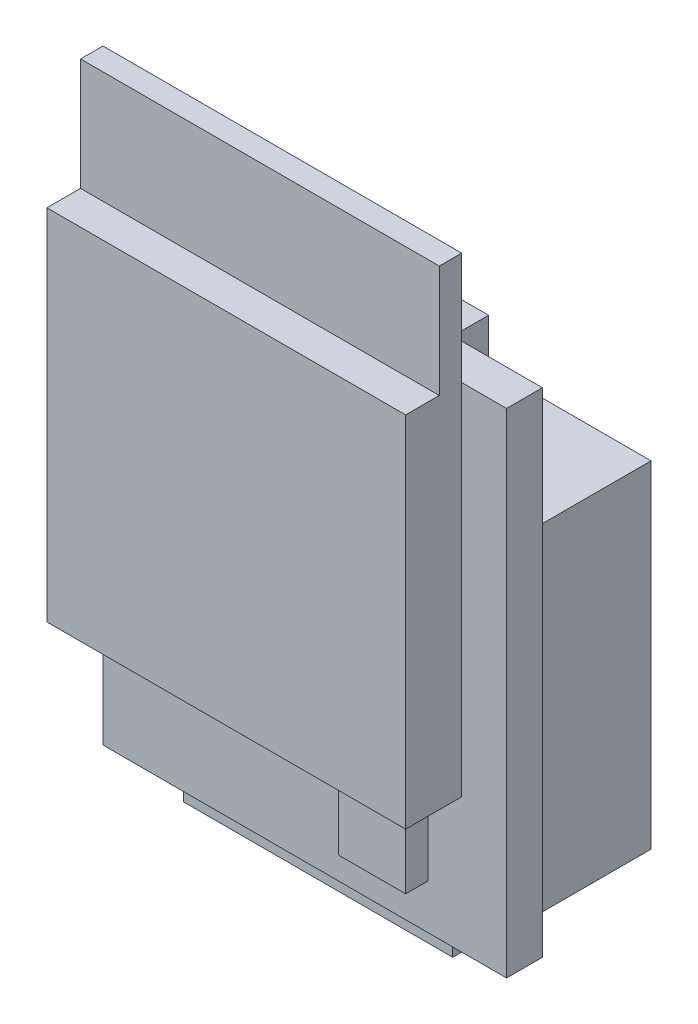
ISO-10303-21;
HEADER;
FILE_DESCRIPTION(('STEP AP214'),'2;1');
FILE_NAME('part.step','',(''),(''),'','','');
FILE_SCHEMA(('AUTOMOTIVE_DESIGN { 1 0 10303 214 1 1 1 1 }'));
ENDSEC;
DATA;
#1=APPLICATION_CONTEXT('core data for automotive mechanical design processes');
#2=APPLICATION_PROTOCOL_DEFINITION('international standard','automotive_design',2000,#1);
#3=PRODUCT_CONTEXT('',#1,'mechanical');
#4=PRODUCT('Part','Part','',(#3));
#5=PRODUCT_RELATED_PRODUCT_CATEGORY('part','',(#4));
#6=PRODUCT_DEFINITION_FORMATION('','',#4);
#7=PRODUCT_DEFINITION_CONTEXT('part definition',#1,'design');
#8=PRODUCT_DEFINITION('design','',#6,#7);
#9=PRODUCT_DEFINITION_SHAPE('','',#8);
#10=(LENGTH_UNIT() NAMED_UNIT(*) SI_UNIT(.MILLI.,.METRE.));
#11=(NAMED_UNIT(*) PLANE_ANGLE_UNIT() SI_UNIT($,.RADIAN.));
#12=(NAMED_UNIT(*) SI_UNIT($,.STERADIAN.) SOLID_ANGLE_UNIT());
#13=UNCERTAINTY_MEASURE_WITH_UNIT(LENGTH_MEASURE(1.E-05),#10,'distance_accuracy_value','');
#14=(GEOMETRIC_REPRESENTATION_CONTEXT(3) GLOBAL_UNCERTAINTY_ASSIGNED_CONTEXT((#13)) GLOBAL_UNIT_ASSIGNED_CONTEXT((#10,
#11,#12)) REPRESENTATION_CONTEXT('',''));
#15=CARTESIAN_POINT('',(0.,0.,0.));
#16=DIRECTION('',(0.,0.,1.));
#17=DIRECTION('',(1.,0.,0.));
#18=AXIS2_PLACEMENT_3D('',#15,#16,#17);
#19=CARTESIAN_POINT('',(55.7531706786723,-28.,0.));
#20=DIRECTION('',(-1.,0.,0.));
#21=DIRECTION('',(0.,0.,1.));
#22=AXIS2_PLACEMENT_3D('',#19,#20,#21);
#23=PLANE('',#22);
#24=DIRECTION('',(0.,-1.,0.));
#25=VECTOR('',#24,1.);
#26=CARTESIAN_POINT('',(55.7531706786723,-28.,0.));
#27=LINE('',#26,#25);
#28=CARTESIAN_POINT('',(55.7531706786723,-28.,0.));
#29=VERTEX_POINT('',#28);
#30=CARTESIAN_POINT('',(55.7531706786723,-50.,0.));
#31=VERTEX_POINT('',#30);
#32=EDGE_CURVE('E506',#29,#31,#27,.T.);
#33=ORIENTED_EDGE('',*,*,#32,.T.);
#34=DIRECTION('',(0.,0.,1.));
#35=VECTOR('',#34,1.);
#36=CARTESIAN_POINT('',(55.7531706786723,-50.,0.));
#37=LINE('',#36,#35);
#38=CARTESIAN_POINT('',(55.7531706786723,-50.,1.6));
#39=VERTEX_POINT('',#38);
#40=EDGE_CURVE('E11',#31,#39,#37,.T.);
#41=ORIENTED_EDGE('',*,*,#40,.T.);
#42=DIRECTION('',(0.,-1.,0.));
#43=VECTOR('',#42,1.);
#44=CARTESIAN_POINT('',(55.7531706786723,-28.,1.6));
#45=LINE('',#44,#43);
#46=CARTESIAN_POINT('',(55.7531706786723,-44.,1.6));
#47=VERTEX_POINT('',#46);
#48=EDGE_CURVE('E452',#47,#39,#45,.T.);
#49=ORIENTED_EDGE('',*,*,#48,.F.);
#50=DIRECTION('',(0.,0.,1.));
#51=VECTOR('',#50,1.);
#52=CARTESIAN_POINT('',(55.7531706786723,-44.,1.6));
#53=LINE('',#52,#51);
#54=CARTESIAN_POINT('',(55.7531706786723,-44.,4.1));
#55=VERTEX_POINT('',#54);
#56=EDGE_CURVE('E331',#47,#55,#53,.T.);
#57=ORIENTED_EDGE('',*,*,#56,.T.);
#58=DIRECTION('',(0.,-1.,0.));
#59=VECTOR('',#58,1.);
#60=CARTESIAN_POINT('',(55.7531706786723,-44.,4.1));
#61=LINE('',#60,#59);
#62=CARTESIAN_POINT('',(55.7531706786723,-28.,4.1));
#63=VERTEX_POINT('',#62);
#64=EDGE_CURVE('E287',#63,#55,#61,.T.);
#65=ORIENTED_EDGE('',*,*,#64,.F.);
#66=DIRECTION('',(0.,0.,1.));
#67=VECTOR('',#66,1.);
#68=CARTESIAN_POINT('',(55.7531706786723,-28.,0.));
#69=LINE('',#68,#67);
#70=CARTESIAN_POINT('',(55.7531706786723,-28.,2.6));
#71=VERTEX_POINT('',#70);
#72=EDGE_CURVE('E303',#71,#63,#69,.T.);
#73=ORIENTED_EDGE('',*,*,#72,.F.);
#74=DIRECTION('',(0.,1.,0.));
#75=VECTOR('',#74,1.);
#76=CARTESIAN_POINT('',(55.7531706786723,-28.,2.6));
#77=LINE('',#76,#75);
#78=CARTESIAN_POINT('',(55.7531706786723,-23.,2.6));
#79=VERTEX_POINT('',#78);
#80=EDGE_CURVE('E380',#71,#79,#77,.T.);
#81=ORIENTED_EDGE('',*,*,#80,.T.);
#82=DIRECTION('',(0.,0.,1.));
#83=VECTOR('',#82,1.);
#84=CARTESIAN_POINT('',(55.7531706786723,-23.,1.6));
#85=LINE('',#84,#83);
#86=CARTESIAN_POINT('',(55.7531706786723,-23.,1.6));
#87=VERTEX_POINT('',#86);
#88=EDGE_CURVE('E300',#87,#79,#85,.T.);
#89=ORIENTED_EDGE('',*,*,#88,.F.);
#90=DIRECTION('',(0.,1.,0.));
#91=VECTOR('',#90,1.);
#92=CARTESIAN_POINT('',(55.7531706786723,-28.,1.6));
#93=LINE('',#92,#91);
#94=CARTESIAN_POINT('',(55.7531706786723,-28.,1.6));
#95=VERTEX_POINT('',#94);
#96=EDGE_CURVE('E379',#95,#87,#93,.T.);
#97=ORIENTED_EDGE('',*,*,#96,.F.);
#98=DIRECTION('',(0.,0.,1.));
#99=VECTOR('',#98,1.);
#100=CARTESIAN_POINT('',(55.7531706786723,-28.,0.));
#101=LINE('',#100,#99);
#102=EDGE_CURVE('E326',#29,#95,#101,.T.);
#103=ORIENTED_EDGE('',*,*,#102,.F.);
#104=EDGE_LOOP('',(#33,#41,#49,#57,#65,#73,#81,#89,#97,#103));
#105=FACE_BOUND('',#104,.T.);
#106=ADVANCED_FACE('F16',(#105),#23,.T.);
#107=CARTESIAN_POINT('',(55.7531706786723,-50.,0.));
#108=DIRECTION('',(0.,-1.,0.));
#109=DIRECTION('',(0.,0.,-1.));
#110=AXIS2_PLACEMENT_3D('',#107,#108,#109);
#111=PLANE('',#110);
#112=DIRECTION('',(1.,0.,0.));
#113=VECTOR('',#112,1.);
#114=CARTESIAN_POINT('',(55.7531706786723,-50.,0.));
#115=LINE('',#114,#113);
#116=CARTESIAN_POINT('',(57.7531706786723,-50.,0.));
#117=VERTEX_POINT('',#116);
#118=EDGE_CURVE('E365',#31,#117,#115,.T.);
#119=ORIENTED_EDGE('',*,*,#118,.T.);
#120=DIRECTION('',(1.,0.,0.));
#121=VECTOR('',#120,1.);
#122=CARTESIAN_POINT('',(55.7531706786723,-50.,0.));
#123=LINE('',#122,#121);
#124=CARTESIAN_POINT('',(69.7531706786723,-50.,0.));
#125=VERTEX_POINT('',#124);
#126=EDGE_CURVE('E366',#117,#125,#123,.T.);
#127=ORIENTED_EDGE('',*,*,#126,.T.);
#128=DIRECTION('',(1.,0.,0.));
#129=VECTOR('',#128,1.);
#130=CARTESIAN_POINT('',(55.7531706786723,-50.,0.));
#131=LINE('',#130,#129);
#132=CARTESIAN_POINT('',(73.7531706786723,-50.,0.));
#133=VERTEX_POINT('',#132);
#134=EDGE_CURVE('E321',#125,#133,#131,.T.);
#135=ORIENTED_EDGE('',*,*,#134,.T.);
#136=DIRECTION('',(0.,0.,1.));
#137=VECTOR('',#136,1.);
#138=CARTESIAN_POINT('',(73.7531706786723,-50.,0.));
#139=LINE('',#138,#137);
#140=CARTESIAN_POINT('',(73.7531706786723,-50.,1.6));
#141=VERTEX_POINT('',#140);
#142=EDGE_CURVE('E27',#133,#141,#139,.T.);
#143=ORIENTED_EDGE('',*,*,#142,.T.);
#144=DIRECTION('',(1.,0.,0.));
#145=VECTOR('',#144,1.);
#146=CARTESIAN_POINT('',(55.7531706786723,-50.,1.6));
#147=LINE('',#146,#145);
#148=EDGE_CURVE('E456',#39,#141,#147,.T.);
#149=ORIENTED_EDGE('',*,*,#148,.F.);
#150=ORIENTED_EDGE('',*,*,#40,.F.);
#151=EDGE_LOOP('',(#119,#127,#135,#143,#149,#150));
#152=FACE_BOUND('',#151,.T.);
#153=ADVANCED_FACE('F558',(#152),#111,.T.);
#154=CARTESIAN_POINT('',(73.7531706786723,-50.,0.));
#155=DIRECTION('',(1.,0.,0.));
#156=DIRECTION('',(0.,1.,0.));
#157=AXIS2_PLACEMENT_3D('',#154,#155,#156);
#158=PLANE('',#157);
#159=DIRECTION('',(0.,1.,0.));
#160=VECTOR('',#159,1.);
#161=CARTESIAN_POINT('',(73.7531706786723,-50.,0.));
#162=LINE('',#161,#160);
#163=CARTESIAN_POINT('',(73.7531706786723,-28.,0.));
#164=VERTEX_POINT('',#163);
#165=EDGE_CURVE('E325',#133,#164,#162,.T.);
#166=ORIENTED_EDGE('',*,*,#165,.T.);
#167=DIRECTION('',(0.,0.,1.));
#168=VECTOR('',#167,1.);
#169=CARTESIAN_POINT('',(73.7531706786723,-28.,0.));
#170=LINE('',#169,#168);
#171=CARTESIAN_POINT('',(73.7531706786723,-28.,1.6));
#172=VERTEX_POINT('',#171);
#173=EDGE_CURVE('E330',#164,#172,#170,.T.);
#174=ORIENTED_EDGE('',*,*,#173,.T.);
#175=DIRECTION('',(0.,1.,0.));
#176=VECTOR('',#175,1.);
#177=CARTESIAN_POINT('',(73.7531706786723,-50.,1.6));
#178=LINE('',#177,#176);
#179=EDGE_CURVE('E484',#141,#172,#178,.T.);
#180=ORIENTED_EDGE('',*,*,#179,.F.);
#181=ORIENTED_EDGE('',*,*,#142,.F.);
#182=EDGE_LOOP('',(#166,#174,#180,#181));
#183=FACE_BOUND('',#182,.T.);
#184=ADVANCED_FACE('F845',(#183),#158,.T.);
#185=CARTESIAN_POINT('',(64.7531706786723,-39.,1.6));
#186=DIRECTION('',(0.,0.,1.));
#187=DIRECTION('',(1.,0.,0.));
#188=AXIS2_PLACEMENT_3D('',#185,#186,#187);
#189=PLANE('',#188);
#190=DIRECTION('',(0.,1.,0.));
#191=VECTOR('',#190,1.);
#192=CARTESIAN_POINT('',(67.2531706786723,-42.25,1.6));
#193=LINE('',#192,#191);
#194=CARTESIAN_POINT('',(67.2531706786723,-48.,1.6));
#195=VERTEX_POINT('',#194);
#196=CARTESIAN_POINT('',(67.2531706786723,-45.5,1.6));
#197=VERTEX_POINT('',#196);
#198=EDGE_CURVE('E352',#195,#197,#193,.T.);
#199=ORIENTED_EDGE('',*,*,#198,.T.);
#200=DIRECTION('',(1.,0.,0.));
#201=VECTOR('',#200,1.);
#202=CARTESIAN_POINT('',(67.5031706786723,-45.5,1.6));
#203=LINE('',#202,#201);
#204=CARTESIAN_POINT('',(70.2531706786723,-45.5,1.6));
#205=VERTEX_POINT('',#204);
#206=EDGE_CURVE('E346',#197,#205,#203,.T.);
#207=ORIENTED_EDGE('',*,*,#206,.T.);
#208=DIRECTION('',(0.,-1.,0.));
#209=VECTOR('',#208,1.);
#210=CARTESIAN_POINT('',(70.2531706786723,-43.5,1.6));
#211=LINE('',#210,#209);
#212=CARTESIAN_POINT('',(70.2531706786723,-48.,1.6));
#213=VERTEX_POINT('',#212);
#214=EDGE_CURVE('E313',#205,#213,#211,.T.);
#215=ORIENTED_EDGE('',*,*,#214,.T.);
#216=DIRECTION('',(-1.,0.,0.));
#217=VECTOR('',#216,1.);
#218=CARTESIAN_POINT('',(66.0031706786723,-48.,1.6));
#219=LINE('',#218,#217);
#220=EDGE_CURVE('E468',#213,#195,#219,.T.);
#221=ORIENTED_EDGE('',*,*,#220,.T.);
#222=EDGE_LOOP('',(#199,#207,#215,#221));
#223=FACE_BOUND('',#222,.T.);
#224=DIRECTION('',(0.,-1.,0.));
#225=VECTOR('',#224,1.);
#226=CARTESIAN_POINT('',(71.7531706786723,-41.5,1.6));
#227=LINE('',#226,#225);
#228=CARTESIAN_POINT('',(71.7531706786723,-28.,1.6));
#229=VERTEX_POINT('',#228);
#230=CARTESIAN_POINT('',(71.7531706786723,-44.,1.6));
#231=VERTEX_POINT('',#230);
#232=EDGE_CURVE('E329',#229,#231,#227,.T.);
#233=ORIENTED_EDGE('',*,*,#232,.T.);
#234=DIRECTION('',(-1.,0.,0.));
#235=VECTOR('',#234,1.);
#236=CARTESIAN_POINT('',(60.2531706786723,-44.,1.6));
#237=LINE('',#236,#235);
#238=EDGE_CURVE('E399',#231,#47,#237,.T.);
#239=ORIENTED_EDGE('',*,*,#238,.T.);
#240=ORIENTED_EDGE('',*,*,#48,.T.);
#241=ORIENTED_EDGE('',*,*,#148,.T.);
#242=ORIENTED_EDGE('',*,*,#179,.T.);
#243=DIRECTION('',(-1.,0.,0.));
#244=VECTOR('',#243,1.);
#245=CARTESIAN_POINT('',(73.7531706786723,-28.,1.6));
#246=LINE('',#245,#244);
#247=EDGE_CURVE('E392',#172,#229,#246,.T.);
#248=ORIENTED_EDGE('',*,*,#247,.T.);
#249=EDGE_LOOP('',(#233,#239,#240,#241,#242,#248));
#250=FACE_BOUND('',#249,.T.);
#251=ADVANCED_FACE('F840',(#223,#250),#189,.T.);
#252=CARTESIAN_POINT('',(63.7531706786723,-36.,4.1));
#253=DIRECTION('',(0.,0.,1.));
#254=DIRECTION('',(1.,0.,0.));
#255=AXIS2_PLACEMENT_3D('',#252,#253,#254);
#256=PLANE('',#255);
#257=DIRECTION('',(1.,0.,0.));
#258=VECTOR('',#257,1.);
#259=CARTESIAN_POINT('',(71.7531706786723,-44.,4.1));
#260=LINE('',#259,#258);
#261=CARTESIAN_POINT('',(71.7531706786723,-44.,4.1));
#262=VERTEX_POINT('',#261);
#263=EDGE_CURVE('E335',#55,#262,#260,.T.);
#264=ORIENTED_EDGE('',*,*,#263,.T.);
#265=DIRECTION('',(0.,1.,0.));
#266=VECTOR('',#265,1.);
#267=CARTESIAN_POINT('',(71.7531706786723,-28.,4.1));
#268=LINE('',#267,#266);
#269=CARTESIAN_POINT('',(71.7531706786723,-28.,4.1));
#270=VERTEX_POINT('',#269);
#271=EDGE_CURVE('E396',#262,#270,#268,.T.);
#272=ORIENTED_EDGE('',*,*,#271,.T.);
#273=DIRECTION('',(-1.,0.,0.));
#274=VECTOR('',#273,1.);
#275=CARTESIAN_POINT('',(55.7531706786723,-28.,4.1));
#276=LINE('',#275,#274);
#277=EDGE_CURVE('E308',#270,#63,#276,.T.);
#278=ORIENTED_EDGE('',*,*,#277,.T.);
#279=ORIENTED_EDGE('',*,*,#64,.T.);
#280=EDGE_LOOP('',(#264,#272,#278,#279));
#281=FACE_BOUND('',#280,.T.);
#282=ADVANCED_FACE('F844',(#281),#256,.T.);
#283=CARTESIAN_POINT('',(55.7531706786723,-44.,1.6));
#284=DIRECTION('',(0.,-1.,0.));
#285=DIRECTION('',(0.,0.,-1.));
#286=AXIS2_PLACEMENT_3D('',#283,#284,#285);
#287=PLANE('',#286);
#288=ORIENTED_EDGE('',*,*,#238,.F.);
#289=DIRECTION('',(0.,0.,1.));
#290=VECTOR('',#289,1.);
#291=CARTESIAN_POINT('',(71.7531706786723,-44.,1.6));
#292=LINE('',#291,#290);
#293=EDGE_CURVE('E473',#231,#262,#292,.T.);
#294=ORIENTED_EDGE('',*,*,#293,.T.);
#295=ORIENTED_EDGE('',*,*,#263,.F.);
#296=ORIENTED_EDGE('',*,*,#56,.F.);
#297=EDGE_LOOP('',(#288,#294,#295,#296));
#298=FACE_BOUND('',#297,.T.);
#299=ADVANCED_FACE('F850',(#298),#287,.T.);
#300=CARTESIAN_POINT('',(71.7531706786723,-44.,1.6));
#301=DIRECTION('',(1.,0.,0.));
#302=DIRECTION('',(0.,1.,0.));
#303=AXIS2_PLACEMENT_3D('',#300,#301,#302);
#304=PLANE('',#303);
#305=ORIENTED_EDGE('',*,*,#232,.F.);
#306=DIRECTION('',(0.,1.,0.));
#307=VECTOR('',#306,1.);
#308=CARTESIAN_POINT('',(71.7531706786723,-28.,1.6));
#309=LINE('',#308,#307);
#310=CARTESIAN_POINT('',(71.7531706786723,-23.,1.6));
#311=VERTEX_POINT('',#310);
#312=EDGE_CURVE('E490',#229,#311,#309,.T.);
#313=ORIENTED_EDGE('',*,*,#312,.T.);
#314=DIRECTION('',(0.,0.,-1.));
#315=VECTOR('',#314,1.);
#316=CARTESIAN_POINT('',(71.7531706786723,-23.,2.6));
#317=LINE('',#316,#315);
#318=CARTESIAN_POINT('',(71.7531706786723,-23.,2.6));
#319=VERTEX_POINT('',#318);
#320=EDGE_CURVE('E304',#319,#311,#317,.T.);
#321=ORIENTED_EDGE('',*,*,#320,.F.);
#322=DIRECTION('',(0.,1.,0.));
#323=VECTOR('',#322,1.);
#324=CARTESIAN_POINT('',(71.7531706786723,-28.,2.6));
#325=LINE('',#324,#323);
#326=CARTESIAN_POINT('',(71.7531706786723,-28.,2.6));
#327=VERTEX_POINT('',#326);
#328=EDGE_CURVE('E423',#327,#319,#325,.T.);
#329=ORIENTED_EDGE('',*,*,#328,.F.);
#330=DIRECTION('',(0.,0.,1.));
#331=VECTOR('',#330,1.);
#332=CARTESIAN_POINT('',(71.7531706786723,-28.,1.6));
#333=LINE('',#332,#331);
#334=EDGE_CURVE('E374',#327,#270,#333,.T.);
#335=ORIENTED_EDGE('',*,*,#334,.T.);
#336=ORIENTED_EDGE('',*,*,#271,.F.);
#337=ORIENTED_EDGE('',*,*,#293,.F.);
#338=EDGE_LOOP('',(#305,#313,#321,#329,#335,#336,#337));
#339=FACE_BOUND('',#338,.T.);
#340=ADVANCED_FACE('F854',(#339),#304,.T.);
#341=CARTESIAN_POINT('',(73.7531706786723,-28.,0.));
#342=DIRECTION('',(0.,1.,0.));
#343=DIRECTION('',(1.,0.,0.));
#344=AXIS2_PLACEMENT_3D('',#341,#342,#343);
#345=PLANE('',#344);
#346=DIRECTION('',(1.,0.,0.));
#347=VECTOR('',#346,1.);
#348=CARTESIAN_POINT('',(72.7531706786723,-28.,1.6));
#349=LINE('',#348,#347);
#350=EDGE_CURVE('E375',#95,#229,#349,.T.);
#351=ORIENTED_EDGE('',*,*,#350,.T.);
#352=ORIENTED_EDGE('',*,*,#247,.F.);
#353=ORIENTED_EDGE('',*,*,#173,.F.);
#354=DIRECTION('',(-1.,0.,0.));
#355=VECTOR('',#354,1.);
#356=CARTESIAN_POINT('',(73.7531706786723,-28.,0.));
#357=LINE('',#356,#355);
#358=CARTESIAN_POINT('',(69.7531706786723,-28.,0.));
#359=VERTEX_POINT('',#358);
#360=EDGE_CURVE('E474',#164,#359,#357,.T.);
#361=ORIENTED_EDGE('',*,*,#360,.T.);
#362=DIRECTION('',(0.,0.,1.));
#363=VECTOR('',#362,1.);
#364=CARTESIAN_POINT('',(69.7531706786723,-28.,-0.4));
#365=LINE('',#364,#363);
#366=CARTESIAN_POINT('',(69.7531706786723,-28.,-1.6));
#367=VERTEX_POINT('',#366);
#368=EDGE_CURVE('E370',#367,#359,#365,.T.);
#369=ORIENTED_EDGE('',*,*,#368,.F.);
#370=DIRECTION('',(1.,0.,0.));
#371=VECTOR('',#370,1.);
#372=CARTESIAN_POINT('',(67.5031706786723,-28.,-1.6));
#373=LINE('',#372,#371);
#374=CARTESIAN_POINT('',(60.7531706786723,-28.,-1.6));
#375=VERTEX_POINT('',#374);
#376=EDGE_CURVE('E283',#375,#367,#373,.T.);
#377=ORIENTED_EDGE('',*,*,#376,.F.);
#378=DIRECTION('',(0.,0.,-1.));
#379=VECTOR('',#378,1.);
#380=CARTESIAN_POINT('',(60.7531706786723,-28.,-1.2));
#381=LINE('',#380,#379);
#382=CARTESIAN_POINT('',(60.7531706786723,-28.,0.));
#383=VERTEX_POINT('',#382);
#384=EDGE_CURVE('E20',#383,#375,#381,.T.);
#385=ORIENTED_EDGE('',*,*,#384,.F.);
#386=DIRECTION('',(-1.,0.,0.));
#387=VECTOR('',#386,1.);
#388=CARTESIAN_POINT('',(73.7531706786723,-28.,0.));
#389=LINE('',#388,#387);
#390=EDGE_CURVE('E536',#383,#29,#389,.T.);
#391=ORIENTED_EDGE('',*,*,#390,.T.);
#392=ORIENTED_EDGE('',*,*,#102,.T.);
#393=EDGE_LOOP('',(#351,#352,#353,#361,#369,#377,#385,#391,#392));
#394=FACE_BOUND('',#393,.T.);
#395=ADVANCED_FACE('F552',(#394),#345,.T.);
#396=CARTESIAN_POINT('',(73.7531706786723,-28.,0.));
#397=DIRECTION('',(0.,1.,0.));
#398=DIRECTION('',(1.,0.,0.));
#399=AXIS2_PLACEMENT_3D('',#396,#397,#398);
#400=PLANE('',#399);
#401=DIRECTION('',(-1.,0.,0.));
#402=VECTOR('',#401,1.);
#403=CARTESIAN_POINT('',(64.7531706786723,-28.,2.6));
#404=LINE('',#403,#402);
#405=EDGE_CURVE('E369',#327,#71,#404,.T.);
#406=ORIENTED_EDGE('',*,*,#405,.T.);
#407=ORIENTED_EDGE('',*,*,#72,.T.);
#408=ORIENTED_EDGE('',*,*,#277,.F.);
#409=ORIENTED_EDGE('',*,*,#334,.F.);
#410=EDGE_LOOP('',(#406,#407,#408,#409));
#411=FACE_BOUND('',#410,.T.);
#412=ADVANCED_FACE('F916',(#411),#400,.T.);
#413=CARTESIAN_POINT('',(63.7531706786723,-23.,2.1));
#414=DIRECTION('',(0.,1.,0.));
#415=DIRECTION('',(1.,0.,0.));
#416=AXIS2_PLACEMENT_3D('',#413,#414,#415);
#417=PLANE('',#416);
#418=ORIENTED_EDGE('',*,*,#320,.T.);
#419=DIRECTION('',(-1.,0.,0.));
#420=VECTOR('',#419,1.);
#421=CARTESIAN_POINT('',(71.7531706786723,-23.,1.6));
#422=LINE('',#421,#420);
#423=EDGE_CURVE('E540',#311,#87,#422,.T.);
#424=ORIENTED_EDGE('',*,*,#423,.T.);
#425=ORIENTED_EDGE('',*,*,#88,.T.);
#426=DIRECTION('',(1.,0.,0.));
#427=VECTOR('',#426,1.);
#428=CARTESIAN_POINT('',(55.7531706786723,-23.,2.6));
#429=LINE('',#428,#427);
#430=EDGE_CURVE('E388',#79,#319,#429,.T.);
#431=ORIENTED_EDGE('',*,*,#430,.T.);
#432=EDGE_LOOP('',(#418,#424,#425,#431));
#433=FACE_BOUND('',#432,.T.);
#434=ADVANCED_FACE('F911',(#433),#417,.T.);
#435=CARTESIAN_POINT('',(71.7531706786723,-28.,1.6));
#436=DIRECTION('',(0.,0.,-1.));
#437=DIRECTION('',(0.,-1.,0.));
#438=AXIS2_PLACEMENT_3D('',#435,#436,#437);
#439=PLANE('',#438);
#440=ORIENTED_EDGE('',*,*,#350,.F.);
#441=ORIENTED_EDGE('',*,*,#96,.T.);
#442=ORIENTED_EDGE('',*,*,#423,.F.);
#443=ORIENTED_EDGE('',*,*,#312,.F.);
#444=EDGE_LOOP('',(#440,#441,#442,#443));
#445=FACE_BOUND('',#444,.T.);
#446=ADVANCED_FACE('F915',(#445),#439,.T.);
#447=CARTESIAN_POINT('',(55.7531706786723,-28.,2.6));
#448=DIRECTION('',(0.,0.,1.));
#449=DIRECTION('',(1.,0.,0.));
#450=AXIS2_PLACEMENT_3D('',#447,#448,#449);
#451=PLANE('',#450);
#452=ORIENTED_EDGE('',*,*,#405,.F.);
#453=ORIENTED_EDGE('',*,*,#328,.T.);
#454=ORIENTED_EDGE('',*,*,#430,.F.);
#455=ORIENTED_EDGE('',*,*,#80,.F.);
#456=EDGE_LOOP('',(#452,#453,#454,#455));
#457=FACE_BOUND('',#456,.T.);
#458=ADVANCED_FACE('F932',(#457),#451,.T.);
#459=CARTESIAN_POINT('',(63.7531706786723,-44.,0.));
#460=DIRECTION('',(0.,0.,-1.));
#461=DIRECTION('',(0.,-1.,0.));
#462=AXIS2_PLACEMENT_3D('',#459,#460,#461);
#463=PLANE('',#462);
#464=ORIENTED_EDGE('',*,*,#126,.F.);
#465=DIRECTION('',(0.,-1.,0.));
#466=VECTOR('',#465,1.);
#467=CARTESIAN_POINT('',(57.7531706786723,-36.,0.));
#468=LINE('',#467,#466);
#469=CARTESIAN_POINT('',(57.7531706786723,-52.,0.));
#470=VERTEX_POINT('',#469);
#471=EDGE_CURVE('E414',#117,#470,#468,.T.);
#472=ORIENTED_EDGE('',*,*,#471,.T.);
#473=DIRECTION('',(1.,0.,0.));
#474=VECTOR('',#473,1.);
#475=CARTESIAN_POINT('',(57.7531706786723,-52.,0.));
#476=LINE('',#475,#474);
#477=CARTESIAN_POINT('',(69.7531706786723,-52.,0.));
#478=VERTEX_POINT('',#477);
#479=EDGE_CURVE('E259',#470,#478,#476,.T.);
#480=ORIENTED_EDGE('',*,*,#479,.T.);
#481=DIRECTION('',(0.,1.,0.));
#482=VECTOR('',#481,1.);
#483=CARTESIAN_POINT('',(69.7531706786723,-52.,0.));
#484=LINE('',#483,#482);
#485=EDGE_CURVE('E255',#478,#125,#484,.T.);
#486=ORIENTED_EDGE('',*,*,#485,.T.);
#487=EDGE_LOOP('',(#464,#472,#480,#486));
#488=FACE_BOUND('',#487,.T.);
#489=ADVANCED_FACE('F562',(#488),#463,.F.);
#490=CARTESIAN_POINT('',(69.7531706786723,-36.,0.));
#491=DIRECTION('',(1.,0.,0.));
#492=DIRECTION('',(0.,1.,0.));
#493=AXIS2_PLACEMENT_3D('',#490,#491,#492);
#494=PLANE('',#493);
#495=ORIENTED_EDGE('',*,*,#485,.F.);
#496=DIRECTION('',(0.,0.,-1.));
#497=VECTOR('',#496,1.);
#498=CARTESIAN_POINT('',(69.7531706786723,-52.,0.));
#499=LINE('',#498,#497);
#500=CARTESIAN_POINT('',(69.7531706786723,-52.,-1.6));
#501=VERTEX_POINT('',#500);
#502=EDGE_CURVE('E246',#478,#501,#499,.T.);
#503=ORIENTED_EDGE('',*,*,#502,.T.);
#504=DIRECTION('',(0.,1.,0.));
#505=VECTOR('',#504,1.);
#506=CARTESIAN_POINT('',(69.7531706786723,-36.,-1.6));
#507=LINE('',#506,#505);
#508=CARTESIAN_POINT('',(69.7531706786723,-50.0000007450581,-1.6));
#509=VERTEX_POINT('',#508);
#510=EDGE_CURVE('E251',#501,#509,#507,.T.);
#511=ORIENTED_EDGE('',*,*,#510,.T.);
#512=DIRECTION('',(0.,1.,0.));
#513=VECTOR('',#512,1.);
#514=CARTESIAN_POINT('',(69.7531706786723,-36.,-1.6));
#515=LINE('',#514,#513);
#516=CARTESIAN_POINT('',(69.7531706786723,-35.0000005215406,-1.6));
#517=VERTEX_POINT('',#516);
#518=EDGE_CURVE('E320',#509,#517,#515,.T.);
#519=ORIENTED_EDGE('',*,*,#518,.T.);
#520=DIRECTION('',(0.,1.,0.));
#521=VECTOR('',#520,1.);
#522=CARTESIAN_POINT('',(69.7531706786723,-36.,-1.6));
#523=LINE('',#522,#521);
#524=EDGE_CURVE('E276',#517,#367,#523,.T.);
#525=ORIENTED_EDGE('',*,*,#524,.T.);
#526=ORIENTED_EDGE('',*,*,#368,.T.);
#527=DIRECTION('',(0.,1.,0.));
#528=VECTOR('',#527,1.);
#529=CARTESIAN_POINT('',(69.7531706786723,-37.5,0.));
#530=LINE('',#529,#528);
#531=EDGE_CURVE('E478',#125,#359,#530,.T.);
#532=ORIENTED_EDGE('',*,*,#531,.F.);
#533=EDGE_LOOP('',(#495,#503,#511,#519,#525,#526,#532));
#534=FACE_BOUND('',#533,.T.);
#535=ADVANCED_FACE('F248',(#534),#494,.T.);
#536=CARTESIAN_POINT('',(69.7531706786723,-52.,0.));
#537=DIRECTION('',(0.,-1.,0.));
#538=DIRECTION('',(0.,0.,-1.));
#539=AXIS2_PLACEMENT_3D('',#536,#537,#538);
#540=PLANE('',#539);
#541=ORIENTED_EDGE('',*,*,#479,.F.);
#542=DIRECTION('',(0.,0.,-1.));
#543=VECTOR('',#542,1.);
#544=CARTESIAN_POINT('',(57.7531706786723,-52.,0.));
#545=LINE('',#544,#543);
#546=CARTESIAN_POINT('',(57.7531706786723,-52.,-1.6));
#547=VERTEX_POINT('',#546);
#548=EDGE_CURVE('E265',#470,#547,#545,.T.);
#549=ORIENTED_EDGE('',*,*,#548,.T.);
#550=DIRECTION('',(-1.,0.,0.));
#551=VECTOR('',#550,1.);
#552=CARTESIAN_POINT('',(57.7531706786723,-52.,-1.6));
#553=LINE('',#552,#551);
#554=EDGE_CURVE('E262',#501,#547,#553,.T.);
#555=ORIENTED_EDGE('',*,*,#554,.F.);
#556=ORIENTED_EDGE('',*,*,#502,.F.);
#557=EDGE_LOOP('',(#541,#549,#555,#556));
#558=FACE_BOUND('',#557,.T.);
#559=ADVANCED_FACE('F263',(#558),#540,.T.);
#560=CARTESIAN_POINT('',(57.7531706786723,-52.,0.));
#561=DIRECTION('',(-1.,0.,0.));
#562=DIRECTION('',(0.,0.,1.));
#563=AXIS2_PLACEMENT_3D('',#560,#561,#562);
#564=PLANE('',#563);
#565=DIRECTION('',(0.,-1.,0.));
#566=VECTOR('',#565,1.);
#567=CARTESIAN_POINT('',(57.7531706786723,-45.5,0.));
#568=LINE('',#567,#566);
#569=CARTESIAN_POINT('',(57.7531706786723,-36.,0.));
#570=VERTEX_POINT('',#569);
#571=EDGE_CURVE('E361',#570,#117,#568,.T.);
#572=ORIENTED_EDGE('',*,*,#571,.F.);
#573=DIRECTION('',(0.,0.,-1.));
#574=VECTOR('',#573,1.);
#575=CARTESIAN_POINT('',(57.7531706786723,-36.,0.));
#576=LINE('',#575,#574);
#577=CARTESIAN_POINT('',(57.7531706786723,-36.,-1.6));
#578=VERTEX_POINT('',#577);
#579=EDGE_CURVE('E512',#570,#578,#576,.T.);
#580=ORIENTED_EDGE('',*,*,#579,.T.);
#581=DIRECTION('',(0.,1.,0.));
#582=VECTOR('',#581,1.);
#583=CARTESIAN_POINT('',(57.7531706786723,-36.,-1.6));
#584=LINE('',#583,#582);
#585=CARTESIAN_POINT('',(57.7531706786723,-50.0000007450581,-1.6));
#586=VERTEX_POINT('',#585);
#587=EDGE_CURVE('E341',#586,#578,#584,.T.);
#588=ORIENTED_EDGE('',*,*,#587,.F.);
#589=DIRECTION('',(0.,1.,0.));
#590=VECTOR('',#589,1.);
#591=CARTESIAN_POINT('',(57.7531706786723,-36.,-1.6));
#592=LINE('',#591,#590);
#593=EDGE_CURVE('E269',#547,#586,#592,.T.);
#594=ORIENTED_EDGE('',*,*,#593,.F.);
#595=ORIENTED_EDGE('',*,*,#548,.F.);
#596=ORIENTED_EDGE('',*,*,#471,.F.);
#597=EDGE_LOOP('',(#572,#580,#588,#594,#595,#596));
#598=FACE_BOUND('',#597,.T.);
#599=ADVANCED_FACE('F565',(#598),#564,.T.);
#600=CARTESIAN_POINT('',(57.7531706786723,-36.,0.));
#601=DIRECTION('',(0.,1.,0.));
#602=DIRECTION('',(1.,0.,0.));
#603=AXIS2_PLACEMENT_3D('',#600,#601,#602);
#604=PLANE('',#603);
#605=DIRECTION('',(0.,0.,-1.));
#606=VECTOR('',#605,1.);
#607=CARTESIAN_POINT('',(60.7531706786723,-36.,-0.8));
#608=LINE('',#607,#606);
#609=CARTESIAN_POINT('',(60.7531706786723,-36.,0.));
#610=VERTEX_POINT('',#609);
#611=CARTESIAN_POINT('',(60.7531706786723,-36.,-1.6));
#612=VERTEX_POINT('',#611);
#613=EDGE_CURVE('E441',#610,#612,#608,.T.);
#614=ORIENTED_EDGE('',*,*,#613,.T.);
#615=DIRECTION('',(1.,0.,0.));
#616=VECTOR('',#615,1.);
#617=CARTESIAN_POINT('',(69.7531706786723,-36.,-1.6));
#618=LINE('',#617,#616);
#619=EDGE_CURVE('E336',#578,#612,#618,.T.);
#620=ORIENTED_EDGE('',*,*,#619,.F.);
#621=ORIENTED_EDGE('',*,*,#579,.F.);
#622=DIRECTION('',(-1.,0.,0.));
#623=VECTOR('',#622,1.);
#624=CARTESIAN_POINT('',(61.2531706786723,-36.,0.));
#625=LINE('',#624,#623);
#626=EDGE_CURVE('E324',#610,#570,#625,.T.);
#627=ORIENTED_EDGE('',*,*,#626,.F.);
#628=EDGE_LOOP('',(#614,#620,#621,#627));
#629=FACE_BOUND('',#628,.T.);
#630=ADVANCED_FACE('F871',(#629),#604,.T.);
#631=CARTESIAN_POINT('',(64.7531706786723,-39.,0.));
#632=DIRECTION('',(0.,0.,1.));
#633=DIRECTION('',(1.,0.,0.));
#634=AXIS2_PLACEMENT_3D('',#631,#632,#633);
#635=PLANE('',#634);
#636=DIRECTION('',(0.,-1.,0.));
#637=VECTOR('',#636,1.);
#638=CARTESIAN_POINT('',(60.7531706786723,-37.5,0.));
#639=LINE('',#638,#637);
#640=EDGE_CURVE('E444',#383,#610,#639,.T.);
#641=ORIENTED_EDGE('',*,*,#640,.T.);
#642=ORIENTED_EDGE('',*,*,#626,.T.);
#643=ORIENTED_EDGE('',*,*,#571,.T.);
#644=ORIENTED_EDGE('',*,*,#118,.F.);
#645=ORIENTED_EDGE('',*,*,#32,.F.);
#646=ORIENTED_EDGE('',*,*,#390,.F.);
#647=EDGE_LOOP('',(#641,#642,#643,#644,#645,#646));
#648=FACE_BOUND('',#647,.T.);
#649=ADVANCED_FACE('F867',(#648),#635,.F.);
#650=CARTESIAN_POINT('',(64.7531706786723,-39.,0.));
#651=DIRECTION('',(0.,0.,1.));
#652=DIRECTION('',(1.,0.,0.));
#653=AXIS2_PLACEMENT_3D('',#650,#651,#652);
#654=PLANE('',#653);
#655=ORIENTED_EDGE('',*,*,#531,.T.);
#656=ORIENTED_EDGE('',*,*,#360,.F.);
#657=ORIENTED_EDGE('',*,*,#165,.F.);
#658=ORIENTED_EDGE('',*,*,#134,.F.);
#659=EDGE_LOOP('',(#655,#656,#657,#658));
#660=FACE_BOUND('',#659,.T.);
#661=ADVANCED_FACE('F557',(#660),#654,.F.);
#662=CARTESIAN_POINT('',(60.7531706786723,-36.,-1.6));
#663=DIRECTION('',(-1.,0.,0.));
#664=DIRECTION('',(0.,0.,1.));
#665=AXIS2_PLACEMENT_3D('',#662,#663,#664);
#666=PLANE('',#665);
#667=ORIENTED_EDGE('',*,*,#384,.T.);
#668=DIRECTION('',(0.,1.,0.));
#669=VECTOR('',#668,1.);
#670=CARTESIAN_POINT('',(60.7531706786723,-36.,-1.6));
#671=LINE('',#670,#669);
#672=CARTESIAN_POINT('',(60.7531706786723,-35.0000005215406,-1.6));
#673=VERTEX_POINT('',#672);
#674=EDGE_CURVE('E384',#673,#375,#671,.T.);
#675=ORIENTED_EDGE('',*,*,#674,.F.);
#676=DIRECTION('',(0.,1.,0.));
#677=VECTOR('',#676,1.);
#678=CARTESIAN_POINT('',(60.7531706786723,-36.,-1.6));
#679=LINE('',#678,#677);
#680=EDGE_CURVE('E340',#612,#673,#679,.T.);
#681=ORIENTED_EDGE('',*,*,#680,.F.);
#682=ORIENTED_EDGE('',*,*,#613,.F.);
#683=ORIENTED_EDGE('',*,*,#640,.F.);
#684=EDGE_LOOP('',(#667,#675,#681,#682,#683));
#685=FACE_BOUND('',#684,.T.);
#686=ADVANCED_FACE('F612',(#685),#666,.T.);
#687=CARTESIAN_POINT('',(68.7531706786723,-46.75,2.6));
#688=DIRECTION('',(0.,0.,1.));
#689=DIRECTION('',(1.,0.,0.));
#690=AXIS2_PLACEMENT_3D('',#687,#688,#689);
#691=PLANE('',#690);
#692=DIRECTION('',(1.,0.,0.));
#693=VECTOR('',#692,1.);
#694=CARTESIAN_POINT('',(70.2531706786723,-48.,2.6));
#695=LINE('',#694,#693);
#696=CARTESIAN_POINT('',(67.2531706786723,-48.,2.6));
#697=VERTEX_POINT('',#696);
#698=CARTESIAN_POINT('',(70.2531706786723,-48.,2.6));
#699=VERTEX_POINT('',#698);
#700=EDGE_CURVE('E518',#697,#699,#695,.T.);
#701=ORIENTED_EDGE('',*,*,#700,.T.);
#702=DIRECTION('',(0.,1.,0.));
#703=VECTOR('',#702,1.);
#704=CARTESIAN_POINT('',(70.2531706786723,-45.5,2.6));
#705=LINE('',#704,#703);
#706=CARTESIAN_POINT('',(70.2531706786723,-45.5,2.6));
#707=VERTEX_POINT('',#706);
#708=EDGE_CURVE('E353',#699,#707,#705,.T.);
#709=ORIENTED_EDGE('',*,*,#708,.T.);
#710=DIRECTION('',(-1.,0.,0.));
#711=VECTOR('',#710,1.);
#712=CARTESIAN_POINT('',(67.2531706786723,-45.5,2.6));
#713=LINE('',#712,#711);
#714=CARTESIAN_POINT('',(67.2531706786723,-45.5,2.6));
#715=VERTEX_POINT('',#714);
#716=EDGE_CURVE('E314',#707,#715,#713,.T.);
#717=ORIENTED_EDGE('',*,*,#716,.T.);
#718=DIRECTION('',(0.,-1.,0.));
#719=VECTOR('',#718,1.);
#720=CARTESIAN_POINT('',(67.2531706786723,-48.,2.6));
#721=LINE('',#720,#719);
#722=EDGE_CURVE('E347',#715,#697,#721,.T.);
#723=ORIENTED_EDGE('',*,*,#722,.T.);
#724=EDGE_LOOP('',(#701,#709,#717,#723));
#725=FACE_BOUND('',#724,.T.);
#726=ADVANCED_FACE('F990',(#725),#691,.T.);
#727=CARTESIAN_POINT('',(67.2531706786723,-48.,1.6));
#728=DIRECTION('',(0.,-1.,0.));
#729=DIRECTION('',(0.,0.,-1.));
#730=AXIS2_PLACEMENT_3D('',#727,#728,#729);
#731=PLANE('',#730);
#732=ORIENTED_EDGE('',*,*,#220,.F.);
#733=DIRECTION('',(0.,0.,1.));
#734=VECTOR('',#733,1.);
#735=CARTESIAN_POINT('',(70.2531706786723,-48.,1.6));
#736=LINE('',#735,#734);
#737=EDGE_CURVE('E357',#213,#699,#736,.T.);
#738=ORIENTED_EDGE('',*,*,#737,.T.);
#739=ORIENTED_EDGE('',*,*,#700,.F.);
#740=DIRECTION('',(0.,0.,1.));
#741=VECTOR('',#740,1.);
#742=CARTESIAN_POINT('',(67.2531706786723,-48.,1.6));
#743=LINE('',#742,#741);
#744=EDGE_CURVE('E348',#195,#697,#743,.T.);
#745=ORIENTED_EDGE('',*,*,#744,.F.);
#746=EDGE_LOOP('',(#732,#738,#739,#745));
#747=FACE_BOUND('',#746,.T.);
#748=ADVANCED_FACE('F985',(#747),#731,.T.);
#749=CARTESIAN_POINT('',(70.2531706786723,-48.,1.6));
#750=DIRECTION('',(1.,0.,0.));
#751=DIRECTION('',(0.,1.,0.));
#752=AXIS2_PLACEMENT_3D('',#749,#750,#751);
#753=PLANE('',#752);
#754=ORIENTED_EDGE('',*,*,#214,.F.);
#755=DIRECTION('',(0.,0.,1.));
#756=VECTOR('',#755,1.);
#757=CARTESIAN_POINT('',(70.2531706786723,-45.5,1.6));
#758=LINE('',#757,#756);
#759=EDGE_CURVE('E309',#205,#707,#758,.T.);
#760=ORIENTED_EDGE('',*,*,#759,.T.);
#761=ORIENTED_EDGE('',*,*,#708,.F.);
#762=ORIENTED_EDGE('',*,*,#737,.F.);
#763=EDGE_LOOP('',(#754,#760,#761,#762));
#764=FACE_BOUND('',#763,.T.);
#765=ADVANCED_FACE('F989',(#764),#753,.T.);
#766=CARTESIAN_POINT('',(70.2531706786723,-45.5,1.6));
#767=DIRECTION('',(0.,1.,0.));
#768=DIRECTION('',(1.,0.,0.));
#769=AXIS2_PLACEMENT_3D('',#766,#767,#768);
#770=PLANE('',#769);
#771=ORIENTED_EDGE('',*,*,#206,.F.);
#772=DIRECTION('',(0.,0.,1.));
#773=VECTOR('',#772,1.);
#774=CARTESIAN_POINT('',(67.2531706786723,-45.5,1.6));
#775=LINE('',#774,#773);
#776=EDGE_CURVE('E342',#197,#715,#775,.T.);
#777=ORIENTED_EDGE('',*,*,#776,.T.);
#778=ORIENTED_EDGE('',*,*,#716,.F.);
#779=ORIENTED_EDGE('',*,*,#759,.F.);
#780=EDGE_LOOP('',(#771,#777,#778,#779));
#781=FACE_BOUND('',#780,.T.);
#782=ADVANCED_FACE('F889',(#781),#770,.T.);
#783=CARTESIAN_POINT('',(67.2531706786723,-45.5,1.6));
#784=DIRECTION('',(-1.,0.,0.));
#785=DIRECTION('',(0.,0.,1.));
#786=AXIS2_PLACEMENT_3D('',#783,#784,#785);
#787=PLANE('',#786);
#788=ORIENTED_EDGE('',*,*,#198,.F.);
#789=ORIENTED_EDGE('',*,*,#744,.T.);
#790=ORIENTED_EDGE('',*,*,#722,.F.);
#791=ORIENTED_EDGE('',*,*,#776,.F.);
#792=EDGE_LOOP('',(#788,#789,#790,#791));
#793=FACE_BOUND('',#792,.T.);
#794=ADVANCED_FACE('F885',(#793),#787,.T.);
#795=CARTESIAN_POINT('',(63.7531706786723,-44.,-1.6));
#796=DIRECTION('',(0.,0.,-1.));
#797=DIRECTION('',(0.,-1.,0.));
#798=AXIS2_PLACEMENT_3D('',#795,#796,#797);
#799=PLANE('',#798);
#800=DIRECTION('',(1.,0.,0.));
#801=VECTOR('',#800,1.);
#802=CARTESIAN_POINT('',(67.876585875778,-50.0000007450581,-1.6));
#803=LINE('',#802,#801);
#804=EDGE_CURVE('E273',#586,#509,#803,.T.);
#805=ORIENTED_EDGE('',*,*,#804,.T.);
#806=ORIENTED_EDGE('',*,*,#510,.F.);
#807=ORIENTED_EDGE('',*,*,#554,.T.);
#808=ORIENTED_EDGE('',*,*,#593,.T.);
#809=EDGE_LOOP('',(#805,#806,#807,#808));
#810=FACE_BOUND('',#809,.T.);
#811=ADVANCED_FACE('F271',(#810),#799,.T.);
#812=CARTESIAN_POINT('',(63.7531706786723,-44.,-1.6));
#813=DIRECTION('',(0.,0.,-1.));
#814=DIRECTION('',(0.,-1.,0.));
#815=AXIS2_PLACEMENT_3D('',#812,#813,#814);
#816=PLANE('',#815);
#817=DIRECTION('',(-1.,0.,0.));
#818=VECTOR('',#817,1.);
#819=CARTESIAN_POINT('',(60.3765857640192,-35.0000005215406,-1.6));
#820=LINE('',#819,#818);
#821=EDGE_CURVE('E428',#517,#673,#820,.T.);
#822=ORIENTED_EDGE('',*,*,#821,.T.);
#823=ORIENTED_EDGE('',*,*,#674,.T.);
#824=ORIENTED_EDGE('',*,*,#376,.T.);
#825=ORIENTED_EDGE('',*,*,#524,.F.);
#826=EDGE_LOOP('',(#822,#823,#824,#825));
#827=FACE_BOUND('',#826,.T.);
#828=ADVANCED_FACE('F604',(#827),#816,.T.);
#829=CARTESIAN_POINT('',(64.5000009611249,-42.5000006332994,-6.6));
#830=DIRECTION('',(0.,0.,-1.));
#831=DIRECTION('',(0.,-1.,0.));
#832=AXIS2_PLACEMENT_3D('',#829,#830,#831);
#833=PLANE('',#832);
#834=DIRECTION('',(1.,0.,0.));
#835=VECTOR('',#834,1.);
#836=CARTESIAN_POINT('',(72.0000010728836,-35.0000005215406,-6.6));
#837=LINE('',#836,#835);
#838=CARTESIAN_POINT('',(57.0000008493662,-35.0000005215406,-6.6));
#839=VERTEX_POINT('',#838);
#840=CARTESIAN_POINT('',(72.0000010728836,-35.0000005215406,-6.6));
#841=VERTEX_POINT('',#840);
#842=EDGE_CURVE('E424',#839,#841,#837,.T.);
#843=ORIENTED_EDGE('',*,*,#842,.T.);
#844=DIRECTION('',(0.,-1.,0.));
#845=VECTOR('',#844,1.);
#846=CARTESIAN_POINT('',(72.0000010728836,-50.0000007450581,-6.6));
#847=LINE('',#846,#845);
#848=CARTESIAN_POINT('',(72.0000010728836,-50.0000007450581,-6.6));
#849=VERTEX_POINT('',#848);
#850=EDGE_CURVE('E289',#841,#849,#847,.T.);
#851=ORIENTED_EDGE('',*,*,#850,.T.);
#852=DIRECTION('',(-1.,0.,0.));
#853=VECTOR('',#852,1.);
#854=CARTESIAN_POINT('',(57.0000008493662,-50.0000007450581,-6.6));
#855=LINE('',#854,#853);
#856=CARTESIAN_POINT('',(57.0000008493662,-50.0000007450581,-6.6));
#857=VERTEX_POINT('',#856);
#858=EDGE_CURVE('E451',#849,#857,#855,.T.);
#859=ORIENTED_EDGE('',*,*,#858,.T.);
#860=DIRECTION('',(0.,1.,0.));
#861=VECTOR('',#860,1.);
#862=CARTESIAN_POINT('',(57.0000008493662,-35.0000005215406,-6.6));
#863=LINE('',#862,#861);
#864=EDGE_CURVE('E409',#857,#839,#863,.T.);
#865=ORIENTED_EDGE('',*,*,#864,.T.);
#866=EDGE_LOOP('',(#843,#851,#859,#865));
#867=FACE_BOUND('',#866,.T.);
#868=ADVANCED_FACE('F957',(#867),#833,.T.);
#869=CARTESIAN_POINT('',(57.0000008493662,-35.0000005215406,-1.6));
#870=DIRECTION('',(0.,1.,0.));
#871=DIRECTION('',(1.,0.,0.));
#872=AXIS2_PLACEMENT_3D('',#869,#870,#871);
#873=PLANE('',#872);
#874=DIRECTION('',(-1.,0.,0.));
#875=VECTOR('',#874,1.);
#876=CARTESIAN_POINT('',(72.0000010728836,-35.0000005215406,-1.6));
#877=LINE('',#876,#875);
#878=CARTESIAN_POINT('',(72.0000010728836,-35.0000005215406,-1.6));
#879=VERTEX_POINT('',#878);
#880=EDGE_CURVE('E432',#879,#517,#877,.T.);
#881=ORIENTED_EDGE('',*,*,#880,.F.);
#882=DIRECTION('',(0.,0.,-1.));
#883=VECTOR('',#882,1.);
#884=CARTESIAN_POINT('',(72.0000010728836,-35.0000005215406,-1.6));
#885=LINE('',#884,#883);
#886=EDGE_CURVE('E293',#879,#841,#885,.T.);
#887=ORIENTED_EDGE('',*,*,#886,.T.);
#888=ORIENTED_EDGE('',*,*,#842,.F.);
#889=DIRECTION('',(0.,0.,-1.));
#890=VECTOR('',#889,1.);
#891=CARTESIAN_POINT('',(57.0000008493662,-35.0000005215406,-1.6));
#892=LINE('',#891,#890);
#893=CARTESIAN_POINT('',(57.0000008493662,-35.0000005215406,-1.6));
#894=VERTEX_POINT('',#893);
#895=EDGE_CURVE('E403',#894,#839,#892,.T.);
#896=ORIENTED_EDGE('',*,*,#895,.F.);
#897=DIRECTION('',(-1.,0.,0.));
#898=VECTOR('',#897,1.);
#899=CARTESIAN_POINT('',(72.0000010728836,-35.0000005215406,-1.6));
#900=LINE('',#899,#898);
#901=EDGE_CURVE('E298',#673,#894,#900,.T.);
#902=ORIENTED_EDGE('',*,*,#901,.F.);
#903=ORIENTED_EDGE('',*,*,#821,.F.);
#904=EDGE_LOOP('',(#881,#887,#888,#896,#902,#903));
#905=FACE_BOUND('',#904,.T.);
#906=ADVANCED_FACE('F607',(#905),#873,.T.);
#907=CARTESIAN_POINT('',(72.0000010728836,-35.0000005215406,-1.6));
#908=DIRECTION('',(1.,0.,0.));
#909=DIRECTION('',(0.,1.,0.));
#910=AXIS2_PLACEMENT_3D('',#907,#908,#909);
#911=PLANE('',#910);
#912=DIRECTION('',(0.,1.,0.));
#913=VECTOR('',#912,1.);
#914=CARTESIAN_POINT('',(72.0000010728836,-50.0000007450581,-1.6));
#915=LINE('',#914,#913);
#916=CARTESIAN_POINT('',(72.0000010728836,-50.0000007450581,-1.6));
#917=VERTEX_POINT('',#916);
#918=EDGE_CURVE('E319',#917,#879,#915,.T.);
#919=ORIENTED_EDGE('',*,*,#918,.F.);
#920=DIRECTION('',(0.,0.,-1.));
#921=VECTOR('',#920,1.);
#922=CARTESIAN_POINT('',(72.0000010728836,-50.0000007450581,-1.6));
#923=LINE('',#922,#921);
#924=EDGE_CURVE('E435',#917,#849,#923,.T.);
#925=ORIENTED_EDGE('',*,*,#924,.T.);
#926=ORIENTED_EDGE('',*,*,#850,.F.);
#927=ORIENTED_EDGE('',*,*,#886,.F.);
#928=EDGE_LOOP('',(#919,#925,#926,#927));
#929=FACE_BOUND('',#928,.T.);
#930=ADVANCED_FACE('F956',(#929),#911,.T.);
#931=CARTESIAN_POINT('',(72.0000010728836,-50.0000007450581,-1.6));
#932=DIRECTION('',(0.,-1.,0.));
#933=DIRECTION('',(0.,0.,-1.));
#934=AXIS2_PLACEMENT_3D('',#931,#932,#933);
#935=PLANE('',#934);
#936=DIRECTION('',(1.,0.,0.));
#937=VECTOR('',#936,1.);
#938=CARTESIAN_POINT('',(57.0000008493662,-50.0000007450581,-1.6));
#939=LINE('',#938,#937);
#940=CARTESIAN_POINT('',(57.0000008493662,-50.0000007450581,-1.6));
#941=VERTEX_POINT('',#940);
#942=EDGE_CURVE('E297',#941,#586,#939,.T.);
#943=ORIENTED_EDGE('',*,*,#942,.F.);
#944=DIRECTION('',(0.,0.,-1.));
#945=VECTOR('',#944,1.);
#946=CARTESIAN_POINT('',(57.0000008493662,-50.0000007450581,-1.6));
#947=LINE('',#946,#945);
#948=EDGE_CURVE('E413',#941,#857,#947,.T.);
#949=ORIENTED_EDGE('',*,*,#948,.T.);
#950=ORIENTED_EDGE('',*,*,#858,.F.);
#951=ORIENTED_EDGE('',*,*,#924,.F.);
#952=DIRECTION('',(1.,0.,0.));
#953=VECTOR('',#952,1.);
#954=CARTESIAN_POINT('',(57.0000008493662,-50.0000007450581,-1.6));
#955=LINE('',#954,#953);
#956=EDGE_CURVE('E315',#509,#917,#955,.T.);
#957=ORIENTED_EDGE('',*,*,#956,.F.);
#958=ORIENTED_EDGE('',*,*,#804,.F.);
#959=EDGE_LOOP('',(#943,#949,#950,#951,#957,#958));
#960=FACE_BOUND('',#959,.T.);
#961=ADVANCED_FACE('F569',(#960),#935,.T.);
#962=CARTESIAN_POINT('',(57.0000008493662,-50.0000007450581,-1.6));
#963=DIRECTION('',(-1.,0.,0.));
#964=DIRECTION('',(0.,0.,1.));
#965=AXIS2_PLACEMENT_3D('',#962,#963,#964);
#966=PLANE('',#965);
#967=DIRECTION('',(0.,-1.,0.));
#968=VECTOR('',#967,1.);
#969=CARTESIAN_POINT('',(57.0000008493662,-35.0000005215406,-1.6));
#970=LINE('',#969,#968);
#971=EDGE_CURVE('E294',#894,#941,#970,.T.);
#972=ORIENTED_EDGE('',*,*,#971,.F.);
#973=ORIENTED_EDGE('',*,*,#895,.T.);
#974=ORIENTED_EDGE('',*,*,#864,.F.);
#975=ORIENTED_EDGE('',*,*,#948,.F.);
#976=EDGE_LOOP('',(#972,#973,#974,#975));
#977=FACE_BOUND('',#976,.T.);
#978=ADVANCED_FACE('F18',(#977),#966,.T.);
#979=CARTESIAN_POINT('',(64.5000009611249,-42.5000006332994,-1.6));
#980=DIRECTION('',(0.,0.,-1.));
#981=DIRECTION('',(0.,-1.,0.));
#982=AXIS2_PLACEMENT_3D('',#979,#980,#981);
#983=PLANE('',#982);
#984=ORIENTED_EDGE('',*,*,#587,.T.);
#985=ORIENTED_EDGE('',*,*,#619,.T.);
#986=ORIENTED_EDGE('',*,*,#680,.T.);
#987=ORIENTED_EDGE('',*,*,#901,.T.);
#988=ORIENTED_EDGE('',*,*,#971,.T.);
#989=ORIENTED_EDGE('',*,*,#942,.T.);
#990=EDGE_LOOP('',(#984,#985,#986,#987,#988,#989));
#991=FACE_BOUND('',#990,.T.);
#992=ADVANCED_FACE('F572',(#991),#983,.F.);
#993=CARTESIAN_POINT('',(64.5000009611249,-42.5000006332994,-1.6));
#994=DIRECTION('',(0.,0.,-1.));
#995=DIRECTION('',(0.,-1.,0.));
#996=AXIS2_PLACEMENT_3D('',#993,#994,#995);
#997=PLANE('',#996);
#998=ORIENTED_EDGE('',*,*,#518,.F.);
#999=ORIENTED_EDGE('',*,*,#956,.T.);
#1000=ORIENTED_EDGE('',*,*,#918,.T.);
#1001=ORIENTED_EDGE('',*,*,#880,.T.);
#1002=EDGE_LOOP('',(#998,#999,#1000,#1001));
#1003=FACE_BOUND('',#1002,.T.);
#1004=ADVANCED_FACE('F880',(#1003),#997,.F.);
#1005=CLOSED_SHELL('',(#106,#153,#184,#251,#282,#299,#340,#395,#412,#434,#446,#458,#489,#535,
#559,#599,#630,#649,#661,#686,#726,#748,#765,#782,#794,#811,#828,#868,#906,#930,#961,#978,#992,#1004));
#1006=MANIFOLD_SOLID_BREP('B1',#1005);
#1007=ADVANCED_BREP_SHAPE_REPRESENTATION('',(#18,#1006),#14);
#1008=SHAPE_DEFINITION_REPRESENTATION(#9,#1007);
ENDSEC;
END-ISO-10303-21;
